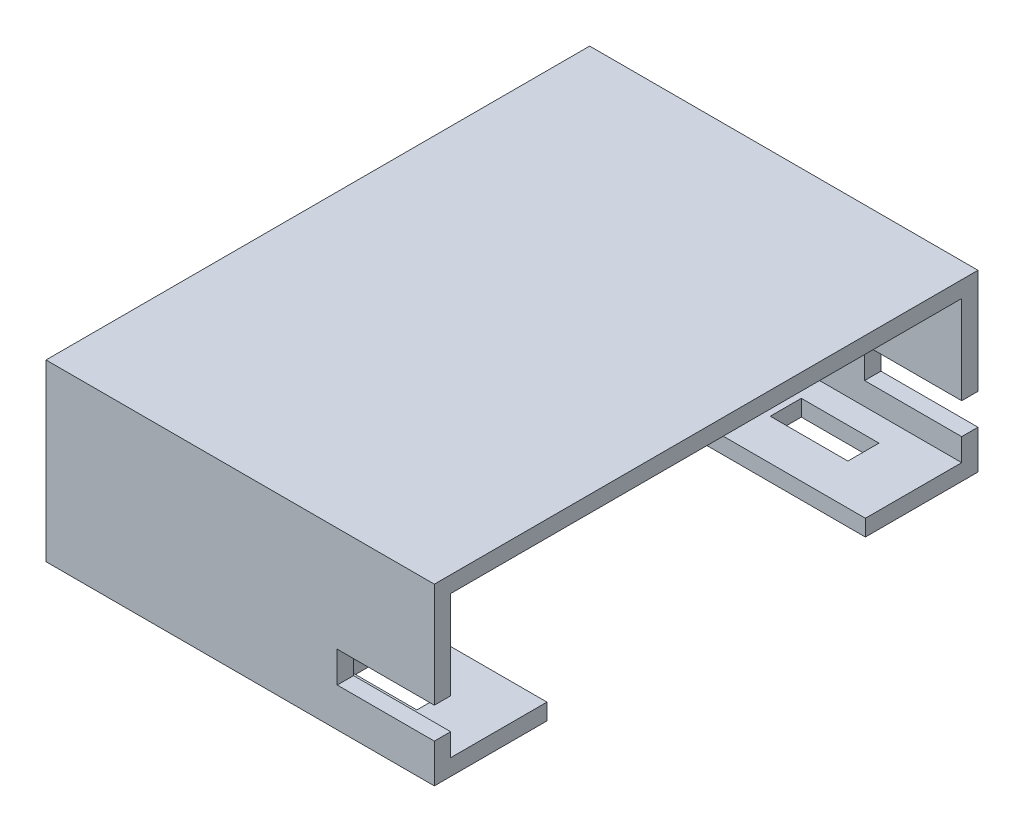
ISO-10303-21;
HEADER;
FILE_DESCRIPTION(('STEP AP214'),'2;1');
FILE_NAME('part.step','',(''),(''),'','','');
FILE_SCHEMA(('AUTOMOTIVE_DESIGN { 1 0 10303 214 1 1 1 1 }'));
ENDSEC;
DATA;
#1=APPLICATION_CONTEXT('core data for automotive mechanical design processes');
#2=APPLICATION_PROTOCOL_DEFINITION('international standard','automotive_design',2000,#1);
#3=PRODUCT_CONTEXT('',#1,'mechanical');
#4=PRODUCT('Part','Part','',(#3));
#5=PRODUCT_RELATED_PRODUCT_CATEGORY('part','',(#4));
#6=PRODUCT_DEFINITION_FORMATION('','',#4);
#7=PRODUCT_DEFINITION_CONTEXT('part definition',#1,'design');
#8=PRODUCT_DEFINITION('design','',#6,#7);
#9=PRODUCT_DEFINITION_SHAPE('','',#8);
#10=(LENGTH_UNIT() NAMED_UNIT(*) SI_UNIT(.MILLI.,.METRE.));
#11=(NAMED_UNIT(*) PLANE_ANGLE_UNIT() SI_UNIT($,.RADIAN.));
#12=(NAMED_UNIT(*) SI_UNIT($,.STERADIAN.) SOLID_ANGLE_UNIT());
#13=UNCERTAINTY_MEASURE_WITH_UNIT(LENGTH_MEASURE(1.E-05),#10,'distance_accuracy_value','');
#14=(GEOMETRIC_REPRESENTATION_CONTEXT(3) GLOBAL_UNCERTAINTY_ASSIGNED_CONTEXT((#13)) GLOBAL_UNIT_ASSIGNED_CONTEXT((#10,
#11,#12)) REPRESENTATION_CONTEXT('',''));
#15=CARTESIAN_POINT('',(0.,0.,0.));
#16=DIRECTION('',(0.,0.,1.));
#17=DIRECTION('',(1.,0.,0.));
#18=AXIS2_PLACEMENT_3D('',#15,#16,#17);
#19=CARTESIAN_POINT('',(10.,0.,-7.));
#20=DIRECTION('',(1.,0.,0.));
#21=DIRECTION('',(0.,0.,-1.));
#22=AXIS2_PLACEMENT_3D('',#19,#20,#21);
#23=PLANE('',#22);
#24=DIRECTION('',(0.,0.,1.));
#25=VECTOR('',#24,1.);
#26=CARTESIAN_POINT('',(10.,-3.5,-7.));
#27=LINE('',#26,#25);
#28=CARTESIAN_POINT('',(10.,-3.5,6.58));
#29=VERTEX_POINT('',#28);
#30=CARTESIAN_POINT('',(10.,-3.5,7.));
#31=VERTEX_POINT('',#30);
#32=EDGE_CURVE('E286',#29,#31,#27,.T.);
#33=ORIENTED_EDGE('',*,*,#32,.T.);
#34=DIRECTION('',(0.,-1.,0.));
#35=VECTOR('',#34,1.);
#36=CARTESIAN_POINT('',(10.,0.,7.));
#37=LINE('',#36,#35);
#38=CARTESIAN_POINT('',(10.,-4.5,7.));
#39=VERTEX_POINT('',#38);
#40=EDGE_CURVE('E418',#31,#39,#37,.T.);
#41=ORIENTED_EDGE('',*,*,#40,.T.);
#42=DIRECTION('',(0.,0.,1.));
#43=VECTOR('',#42,1.);
#44=CARTESIAN_POINT('',(10.,-4.5,-7.));
#45=LINE('',#44,#43);
#46=CARTESIAN_POINT('',(10.,-4.5,4.1));
#47=VERTEX_POINT('',#46);
#48=EDGE_CURVE('E411',#47,#39,#45,.T.);
#49=ORIENTED_EDGE('',*,*,#48,.F.);
#50=DIRECTION('',(0.,-1.,0.));
#51=VECTOR('',#50,1.);
#52=CARTESIAN_POINT('',(10.,-0.42,4.1));
#53=LINE('',#52,#51);
#54=CARTESIAN_POINT('',(10.,-4.08,4.1));
#55=VERTEX_POINT('',#54);
#56=EDGE_CURVE('E374',#55,#47,#53,.T.);
#57=ORIENTED_EDGE('',*,*,#56,.F.);
#58=DIRECTION('',(0.,0.,1.));
#59=VECTOR('',#58,1.);
#60=CARTESIAN_POINT('',(10.,-4.08,-7.001));
#61=LINE('',#60,#59);
#62=CARTESIAN_POINT('',(10.,-4.08,6.58));
#63=VERTEX_POINT('',#62);
#64=EDGE_CURVE('E364',#55,#63,#61,.T.);
#65=ORIENTED_EDGE('',*,*,#64,.T.);
#66=DIRECTION('',(0.,1.,0.));
#67=VECTOR('',#66,1.);
#68=CARTESIAN_POINT('',(10.,-4.08,6.58));
#69=LINE('',#68,#67);
#70=EDGE_CURVE('E355',#63,#29,#69,.T.);
#71=ORIENTED_EDGE('',*,*,#70,.T.);
#72=EDGE_LOOP('',(#33,#41,#49,#57,#65,#71));
#73=FACE_BOUND('',#72,.T.);
#74=ADVANCED_FACE('F33',(#73),#23,.T.);
#75=DIRECTION('',(0.,0.,-1.));
#76=VECTOR('',#75,1.);
#77=CARTESIAN_POINT('',(10.,-3.5,7.001));
#78=LINE('',#77,#76);
#79=CARTESIAN_POINT('',(10.,-3.5,-6.58));
#80=VERTEX_POINT('',#79);
#81=CARTESIAN_POINT('',(10.,-3.5,-7.));
#82=VERTEX_POINT('',#81);
#83=EDGE_CURVE('E324',#80,#82,#78,.T.);
#84=ORIENTED_EDGE('',*,*,#83,.F.);
#85=DIRECTION('',(0.,-1.,0.));
#86=VECTOR('',#85,1.);
#87=CARTESIAN_POINT('',(10.,-0.42,-6.58));
#88=LINE('',#87,#86);
#89=CARTESIAN_POINT('',(10.,-4.08,-6.58));
#90=VERTEX_POINT('',#89);
#91=EDGE_CURVE('E329',#80,#90,#88,.T.);
#92=ORIENTED_EDGE('',*,*,#91,.T.);
#93=DIRECTION('',(0.,0.,-1.));
#94=VECTOR('',#93,1.);
#95=CARTESIAN_POINT('',(10.,-4.08,7.001));
#96=LINE('',#95,#94);
#97=CARTESIAN_POINT('',(10.,-4.08,-4.1));
#98=VERTEX_POINT('',#97);
#99=EDGE_CURVE('E342',#98,#90,#96,.T.);
#100=ORIENTED_EDGE('',*,*,#99,.F.);
#101=DIRECTION('',(0.,1.,0.));
#102=VECTOR('',#101,1.);
#103=CARTESIAN_POINT('',(10.,-4.5,-4.1));
#104=LINE('',#103,#102);
#105=CARTESIAN_POINT('',(10.,-4.5,-4.1));
#106=VERTEX_POINT('',#105);
#107=EDGE_CURVE('E367',#106,#98,#104,.T.);
#108=ORIENTED_EDGE('',*,*,#107,.F.);
#109=CARTESIAN_POINT('',(10.,-4.5,-7.));
#110=VERTEX_POINT('',#109);
#111=EDGE_CURVE('E412',#110,#106,#45,.T.);
#112=ORIENTED_EDGE('',*,*,#111,.F.);
#113=DIRECTION('',(0.,-1.,0.));
#114=VECTOR('',#113,1.);
#115=CARTESIAN_POINT('',(10.,0.,-7.));
#116=LINE('',#115,#114);
#117=EDGE_CURVE('E421',#82,#110,#116,.T.);
#118=ORIENTED_EDGE('',*,*,#117,.F.);
#119=EDGE_LOOP('',(#84,#92,#100,#108,#112,#118));
#120=FACE_BOUND('',#119,.T.);
#121=ADVANCED_FACE('F465',(#120),#23,.T.);
#122=CARTESIAN_POINT('',(0.,0.,7.));
#123=DIRECTION('',(-1.,0.,0.));
#124=DIRECTION('',(0.,0.,1.));
#125=AXIS2_PLACEMENT_3D('',#122,#123,#124);
#126=PLANE('',#125);
#127=DIRECTION('',(0.,0.,-1.));
#128=VECTOR('',#127,1.);
#129=CARTESIAN_POINT('',(0.,-4.5,7.));
#130=LINE('',#129,#128);
#131=CARTESIAN_POINT('',(0.,-4.5,7.));
#132=VERTEX_POINT('',#131);
#133=CARTESIAN_POINT('',(0.,-4.5,-7.));
#134=VERTEX_POINT('',#133);
#135=EDGE_CURVE('E391',#132,#134,#130,.T.);
#136=ORIENTED_EDGE('',*,*,#135,.F.);
#137=DIRECTION('',(0.,-1.,0.));
#138=VECTOR('',#137,1.);
#139=CARTESIAN_POINT('',(0.,0.,7.));
#140=LINE('',#139,#138);
#141=CARTESIAN_POINT('',(0.,0.,7.));
#142=VERTEX_POINT('',#141);
#143=EDGE_CURVE('E11',#142,#132,#140,.T.);
#144=ORIENTED_EDGE('',*,*,#143,.F.);
#145=DIRECTION('',(0.,0.,-1.));
#146=VECTOR('',#145,1.);
#147=CARTESIAN_POINT('',(0.,0.,7.));
#148=LINE('',#147,#146);
#149=CARTESIAN_POINT('',(0.,0.,-7.));
#150=VERTEX_POINT('',#149);
#151=EDGE_CURVE('E393',#142,#150,#148,.T.);
#152=ORIENTED_EDGE('',*,*,#151,.T.);
#153=DIRECTION('',(0.,-1.,0.));
#154=VECTOR('',#153,1.);
#155=CARTESIAN_POINT('',(0.,0.,-7.));
#156=LINE('',#155,#154);
#157=EDGE_CURVE('E37',#150,#134,#156,.T.);
#158=ORIENTED_EDGE('',*,*,#157,.T.);
#159=EDGE_LOOP('',(#136,#144,#152,#158));
#160=FACE_BOUND('',#159,.T.);
#161=ADVANCED_FACE('F35',(#160),#126,.T.);
#162=CARTESIAN_POINT('',(10.,0.,7.));
#163=DIRECTION('',(0.,0.,1.));
#164=DIRECTION('',(1.,0.,0.));
#165=AXIS2_PLACEMENT_3D('',#162,#163,#164);
#166=PLANE('',#165);
#167=DIRECTION('',(1.,0.,0.));
#168=VECTOR('',#167,1.);
#169=CARTESIAN_POINT('',(7.5,-3.5,7.));
#170=LINE('',#169,#168);
#171=CARTESIAN_POINT('',(7.5,-3.5,7.));
#172=VERTEX_POINT('',#171);
#173=EDGE_CURVE('E278',#172,#31,#170,.T.);
#174=ORIENTED_EDGE('',*,*,#173,.F.);
#175=DIRECTION('',(0.,-1.,0.));
#176=VECTOR('',#175,1.);
#177=CARTESIAN_POINT('',(7.5,-2.7,7.));
#178=LINE('',#177,#176);
#179=CARTESIAN_POINT('',(7.5,-2.7,7.));
#180=VERTEX_POINT('',#179);
#181=EDGE_CURVE('E283',#180,#172,#178,.T.);
#182=ORIENTED_EDGE('',*,*,#181,.F.);
#183=DIRECTION('',(-1.,0.,0.));
#184=VECTOR('',#183,1.);
#185=CARTESIAN_POINT('',(10.,-2.7,7.));
#186=LINE('',#185,#184);
#187=CARTESIAN_POINT('',(10.,-2.7,7.));
#188=VERTEX_POINT('',#187);
#189=EDGE_CURVE('E280',#188,#180,#186,.T.);
#190=ORIENTED_EDGE('',*,*,#189,.F.);
#191=CARTESIAN_POINT('',(10.,0.,7.));
#192=VERTEX_POINT('',#191);
#193=EDGE_CURVE('E42',#192,#188,#37,.T.);
#194=ORIENTED_EDGE('',*,*,#193,.F.);
#195=DIRECTION('',(-1.,0.,0.));
#196=VECTOR('',#195,1.);
#197=CARTESIAN_POINT('',(10.,0.,7.));
#198=LINE('',#197,#196);
#199=EDGE_CURVE('E403',#192,#142,#198,.T.);
#200=ORIENTED_EDGE('',*,*,#199,.T.);
#201=ORIENTED_EDGE('',*,*,#143,.T.);
#202=DIRECTION('',(-1.,0.,0.));
#203=VECTOR('',#202,1.);
#204=CARTESIAN_POINT('',(10.,-4.5,7.));
#205=LINE('',#204,#203);
#206=EDGE_CURVE('E397',#39,#132,#205,.T.);
#207=ORIENTED_EDGE('',*,*,#206,.F.);
#208=ORIENTED_EDGE('',*,*,#40,.F.);
#209=EDGE_LOOP('',(#174,#182,#190,#194,#200,#201,#207,#208));
#210=FACE_BOUND('',#209,.T.);
#211=ADVANCED_FACE('F441',(#210),#166,.T.);
#212=DIRECTION('',(0.,0.,1.));
#213=VECTOR('',#212,1.);
#214=CARTESIAN_POINT('',(10.,-2.7,-7.));
#215=LINE('',#214,#213);
#216=CARTESIAN_POINT('',(10.,-2.7,6.58));
#217=VERTEX_POINT('',#216);
#218=EDGE_CURVE('E292',#217,#188,#215,.T.);
#219=ORIENTED_EDGE('',*,*,#218,.F.);
#220=CARTESIAN_POINT('',(10.,-0.42,6.58));
#221=VERTEX_POINT('',#220);
#222=EDGE_CURVE('E354',#217,#221,#69,.T.);
#223=ORIENTED_EDGE('',*,*,#222,.T.);
#224=DIRECTION('',(0.,0.,1.));
#225=VECTOR('',#224,1.);
#226=CARTESIAN_POINT('',(10.,-0.42,-4.1));
#227=LINE('',#226,#225);
#228=CARTESIAN_POINT('',(10.,-0.42,-6.58));
#229=VERTEX_POINT('',#228);
#230=EDGE_CURVE('E384',#229,#221,#227,.T.);
#231=ORIENTED_EDGE('',*,*,#230,.F.);
#232=CARTESIAN_POINT('',(10.,-2.7,-6.58));
#233=VERTEX_POINT('',#232);
#234=EDGE_CURVE('E330',#229,#233,#88,.T.);
#235=ORIENTED_EDGE('',*,*,#234,.T.);
#236=DIRECTION('',(0.,0.,-1.));
#237=VECTOR('',#236,1.);
#238=CARTESIAN_POINT('',(10.,-2.7,7.001));
#239=LINE('',#238,#237);
#240=CARTESIAN_POINT('',(10.,-2.7,-7.));
#241=VERTEX_POINT('',#240);
#242=EDGE_CURVE('E321',#233,#241,#239,.T.);
#243=ORIENTED_EDGE('',*,*,#242,.T.);
#244=CARTESIAN_POINT('',(10.,0.,-7.));
#245=VERTEX_POINT('',#244);
#246=EDGE_CURVE('E419',#245,#241,#116,.T.);
#247=ORIENTED_EDGE('',*,*,#246,.F.);
#248=DIRECTION('',(0.,0.,1.));
#249=VECTOR('',#248,1.);
#250=CARTESIAN_POINT('',(10.,0.,-7.));
#251=LINE('',#250,#249);
#252=EDGE_CURVE('E400',#245,#192,#251,.T.);
#253=ORIENTED_EDGE('',*,*,#252,.T.);
#254=ORIENTED_EDGE('',*,*,#193,.T.);
#255=EDGE_LOOP('',(#219,#223,#231,#235,#243,#247,#253,#254));
#256=FACE_BOUND('',#255,.T.);
#257=ADVANCED_FACE('F448',(#256),#23,.T.);
#258=CARTESIAN_POINT('',(0.,0.,-7.));
#259=DIRECTION('',(0.,0.,-1.));
#260=DIRECTION('',(-1.,0.,0.));
#261=AXIS2_PLACEMENT_3D('',#258,#259,#260);
#262=PLANE('',#261);
#263=DIRECTION('',(-1.,0.,0.));
#264=VECTOR('',#263,1.);
#265=CARTESIAN_POINT('',(10.,-3.5,-7.));
#266=LINE('',#265,#264);
#267=CARTESIAN_POINT('',(7.5,-3.5,-7.));
#268=VERTEX_POINT('',#267);
#269=EDGE_CURVE('E307',#82,#268,#266,.T.);
#270=ORIENTED_EDGE('',*,*,#269,.F.);
#271=ORIENTED_EDGE('',*,*,#117,.T.);
#272=DIRECTION('',(1.,0.,0.));
#273=VECTOR('',#272,1.);
#274=CARTESIAN_POINT('',(0.,-4.5,-7.));
#275=LINE('',#274,#273);
#276=EDGE_CURVE('E408',#134,#110,#275,.T.);
#277=ORIENTED_EDGE('',*,*,#276,.F.);
#278=ORIENTED_EDGE('',*,*,#157,.F.);
#279=DIRECTION('',(1.,0.,0.));
#280=VECTOR('',#279,1.);
#281=CARTESIAN_POINT('',(0.,0.,-7.));
#282=LINE('',#281,#280);
#283=EDGE_CURVE('E396',#150,#245,#282,.T.);
#284=ORIENTED_EDGE('',*,*,#283,.T.);
#285=ORIENTED_EDGE('',*,*,#246,.T.);
#286=DIRECTION('',(1.,0.,0.));
#287=VECTOR('',#286,1.);
#288=CARTESIAN_POINT('',(7.5,-2.7,-7.));
#289=LINE('',#288,#287);
#290=CARTESIAN_POINT('',(7.5,-2.7,-7.));
#291=VERTEX_POINT('',#290);
#292=EDGE_CURVE('E309',#291,#241,#289,.T.);
#293=ORIENTED_EDGE('',*,*,#292,.F.);
#294=DIRECTION('',(0.,1.,0.));
#295=VECTOR('',#294,1.);
#296=CARTESIAN_POINT('',(7.5,-3.5,-7.));
#297=LINE('',#296,#295);
#298=EDGE_CURVE('E312',#268,#291,#297,.T.);
#299=ORIENTED_EDGE('',*,*,#298,.F.);
#300=EDGE_LOOP('',(#270,#271,#277,#278,#284,#285,#293,#299));
#301=FACE_BOUND('',#300,.T.);
#302=ADVANCED_FACE('F432',(#301),#262,.T.);
#303=CARTESIAN_POINT('',(0.,0.,0.));
#304=DIRECTION('',(0.,-1.,0.));
#305=DIRECTION('',(0.,0.,-1.));
#306=AXIS2_PLACEMENT_3D('',#303,#304,#305);
#307=PLANE('',#306);
#308=ORIENTED_EDGE('',*,*,#151,.F.);
#309=ORIENTED_EDGE('',*,*,#199,.F.);
#310=ORIENTED_EDGE('',*,*,#252,.F.);
#311=ORIENTED_EDGE('',*,*,#283,.F.);
#312=EDGE_LOOP('',(#308,#309,#310,#311));
#313=FACE_BOUND('',#312,.T.);
#314=ADVANCED_FACE('F444',(#313),#307,.F.);
#315=CARTESIAN_POINT('',(0.,-4.5,0.));
#316=DIRECTION('',(0.,-1.,0.));
#317=DIRECTION('',(0.,0.,-1.));
#318=AXIS2_PLACEMENT_3D('',#315,#316,#317);
#319=PLANE('',#318);
#320=DIRECTION('',(-1.,0.,0.));
#321=VECTOR('',#320,1.);
#322=CARTESIAN_POINT('',(8.5,-4.5,-5.149999999999));
#323=LINE('',#322,#321);
#324=CARTESIAN_POINT('',(8.5,-4.5,-5.149999999999));
#325=VERTEX_POINT('',#324);
#326=CARTESIAN_POINT('',(6.5,-4.5,-5.149999999999));
#327=VERTEX_POINT('',#326);
#328=EDGE_CURVE('E689',#325,#327,#323,.T.);
#329=ORIENTED_EDGE('',*,*,#328,.F.);
#330=DIRECTION('',(0.,0.,1.));
#331=VECTOR('',#330,1.);
#332=CARTESIAN_POINT('',(8.5,-4.5,-5.950000000003));
#333=LINE('',#332,#331);
#334=CARTESIAN_POINT('',(8.5,-4.5,-5.950000000003));
#335=VERTEX_POINT('',#334);
#336=EDGE_CURVE('E239',#335,#325,#333,.T.);
#337=ORIENTED_EDGE('',*,*,#336,.F.);
#338=DIRECTION('',(1.,0.,0.));
#339=VECTOR('',#338,1.);
#340=CARTESIAN_POINT('',(6.5,-4.5,-5.950000000003));
#341=LINE('',#340,#339);
#342=CARTESIAN_POINT('',(6.5,-4.5,-5.950000000003));
#343=VERTEX_POINT('',#342);
#344=EDGE_CURVE('E50',#343,#335,#341,.T.);
#345=ORIENTED_EDGE('',*,*,#344,.F.);
#346=DIRECTION('',(0.,0.,-1.));
#347=VECTOR('',#346,1.);
#348=CARTESIAN_POINT('',(6.5,-4.5,-5.149999999999));
#349=LINE('',#348,#347);
#350=EDGE_CURVE('E687',#327,#343,#349,.T.);
#351=ORIENTED_EDGE('',*,*,#350,.F.);
#352=EDGE_LOOP('',(#329,#337,#345,#351));
#353=FACE_BOUND('',#352,.T.);
#354=DIRECTION('',(-1.,0.,0.));
#355=VECTOR('',#354,1.);
#356=CARTESIAN_POINT('',(8.5,-4.5,5.949999999999));
#357=LINE('',#356,#355);
#358=CARTESIAN_POINT('',(8.5,-4.5,5.949999999999));
#359=VERTEX_POINT('',#358);
#360=CARTESIAN_POINT('',(6.5,-4.5,5.949999999999));
#361=VERTEX_POINT('',#360);
#362=EDGE_CURVE('E256',#359,#361,#357,.T.);
#363=ORIENTED_EDGE('',*,*,#362,.F.);
#364=DIRECTION('',(0.,0.,1.));
#365=VECTOR('',#364,1.);
#366=CARTESIAN_POINT('',(8.5,-4.5,5.149999999999));
#367=LINE('',#366,#365);
#368=CARTESIAN_POINT('',(8.5,-4.5,5.149999999999));
#369=VERTEX_POINT('',#368);
#370=EDGE_CURVE('E259',#369,#359,#367,.T.);
#371=ORIENTED_EDGE('',*,*,#370,.F.);
#372=DIRECTION('',(1.,0.,0.));
#373=VECTOR('',#372,1.);
#374=CARTESIAN_POINT('',(6.5,-4.5,5.149999999999));
#375=LINE('',#374,#373);
#376=CARTESIAN_POINT('',(6.5,-4.5,5.149999999999));
#377=VERTEX_POINT('',#376);
#378=EDGE_CURVE('E250',#377,#369,#375,.T.);
#379=ORIENTED_EDGE('',*,*,#378,.F.);
#380=DIRECTION('',(0.,0.,-1.));
#381=VECTOR('',#380,1.);
#382=CARTESIAN_POINT('',(6.5,-4.5,5.949999999999));
#383=LINE('',#382,#381);
#384=EDGE_CURVE('E253',#361,#377,#383,.T.);
#385=ORIENTED_EDGE('',*,*,#384,.F.);
#386=EDGE_LOOP('',(#363,#371,#379,#385));
#387=FACE_BOUND('',#386,.T.);
#388=DIRECTION('',(1.,0.,0.));
#389=VECTOR('',#388,1.);
#390=CARTESIAN_POINT('',(5.,-4.5,4.1));
#391=LINE('',#390,#389);
#392=CARTESIAN_POINT('',(5.,-4.5,4.1));
#393=VERTEX_POINT('',#392);
#394=EDGE_CURVE('E388',#393,#47,#391,.T.);
#395=ORIENTED_EDGE('',*,*,#394,.T.);
#396=ORIENTED_EDGE('',*,*,#48,.T.);
#397=ORIENTED_EDGE('',*,*,#206,.T.);
#398=ORIENTED_EDGE('',*,*,#135,.T.);
#399=ORIENTED_EDGE('',*,*,#276,.T.);
#400=ORIENTED_EDGE('',*,*,#111,.T.);
#401=DIRECTION('',(1.,0.,0.));
#402=VECTOR('',#401,1.);
#403=CARTESIAN_POINT('',(5.,-4.5,-4.1));
#404=LINE('',#403,#402);
#405=CARTESIAN_POINT('',(5.,-4.5,-4.1));
#406=VERTEX_POINT('',#405);
#407=EDGE_CURVE('E381',#406,#106,#404,.T.);
#408=ORIENTED_EDGE('',*,*,#407,.F.);
#409=DIRECTION('',(0.,0.,-1.));
#410=VECTOR('',#409,1.);
#411=CARTESIAN_POINT('',(5.,-4.5,4.1));
#412=LINE('',#411,#410);
#413=EDGE_CURVE('E370',#393,#406,#412,.T.);
#414=ORIENTED_EDGE('',*,*,#413,.F.);
#415=EDGE_LOOP('',(#395,#396,#397,#398,#399,#400,#408,#414));
#416=FACE_BOUND('',#415,.T.);
#417=ADVANCED_FACE('F434',(#353,#387,#416),#319,.T.);
#418=CARTESIAN_POINT('',(5.,-0.42,4.1));
#419=DIRECTION('',(0.,0.,1.));
#420=DIRECTION('',(0.,-1.,0.));
#421=AXIS2_PLACEMENT_3D('',#418,#419,#420);
#422=PLANE('',#421);
#423=DIRECTION('',(0.,-1.,0.));
#424=VECTOR('',#423,1.);
#425=CARTESIAN_POINT('',(5.,-0.42,4.1));
#426=LINE('',#425,#424);
#427=CARTESIAN_POINT('',(5.,-4.08,4.1));
#428=VERTEX_POINT('',#427);
#429=EDGE_CURVE('E379',#428,#393,#426,.T.);
#430=ORIENTED_EDGE('',*,*,#429,.F.);
#431=DIRECTION('',(-1.,0.,0.));
#432=VECTOR('',#431,1.);
#433=CARTESIAN_POINT('',(5.,-4.08,4.1));
#434=LINE('',#433,#432);
#435=EDGE_CURVE('E349',#55,#428,#434,.T.);
#436=ORIENTED_EDGE('',*,*,#435,.F.);
#437=ORIENTED_EDGE('',*,*,#56,.T.);
#438=ORIENTED_EDGE('',*,*,#394,.F.);
#439=EDGE_LOOP('',(#430,#436,#437,#438));
#440=FACE_BOUND('',#439,.T.);
#441=ADVANCED_FACE('F480',(#440),#422,.F.);
#442=CARTESIAN_POINT('',(5.,-0.42,-4.1));
#443=DIRECTION('',(0.,1.,0.));
#444=DIRECTION('',(0.,0.,1.));
#445=AXIS2_PLACEMENT_3D('',#442,#443,#444);
#446=PLANE('',#445);
#447=ORIENTED_EDGE('',*,*,#230,.T.);
#448=DIRECTION('',(-1.,0.,0.));
#449=VECTOR('',#448,1.);
#450=CARTESIAN_POINT('',(10.,-0.42,6.58));
#451=LINE('',#450,#449);
#452=CARTESIAN_POINT('',(5.,-0.42,6.58));
#453=VERTEX_POINT('',#452);
#454=EDGE_CURVE('E358',#221,#453,#451,.T.);
#455=ORIENTED_EDGE('',*,*,#454,.T.);
#456=DIRECTION('',(0.,0.,1.));
#457=VECTOR('',#456,1.);
#458=CARTESIAN_POINT('',(5.,-0.42,-4.1));
#459=LINE('',#458,#457);
#460=CARTESIAN_POINT('',(5.,-0.42,-6.58));
#461=VERTEX_POINT('',#460);
#462=EDGE_CURVE('E377',#461,#453,#459,.T.);
#463=ORIENTED_EDGE('',*,*,#462,.F.);
#464=DIRECTION('',(1.,0.,0.));
#465=VECTOR('',#464,1.);
#466=CARTESIAN_POINT('',(5.,-0.42,-6.58));
#467=LINE('',#466,#465);
#468=EDGE_CURVE('E339',#461,#229,#467,.T.);
#469=ORIENTED_EDGE('',*,*,#468,.T.);
#470=EDGE_LOOP('',(#447,#455,#463,#469));
#471=FACE_BOUND('',#470,.T.);
#472=ADVANCED_FACE('F500',(#471),#446,.F.);
#473=CARTESIAN_POINT('',(5.,-4.5,-4.1));
#474=DIRECTION('',(0.,0.,-1.));
#475=DIRECTION('',(0.,1.,0.));
#476=AXIS2_PLACEMENT_3D('',#473,#474,#475);
#477=PLANE('',#476);
#478=ORIENTED_EDGE('',*,*,#107,.T.);
#479=DIRECTION('',(1.,0.,0.));
#480=VECTOR('',#479,1.);
#481=CARTESIAN_POINT('',(10.,-4.08,-4.1));
#482=LINE('',#481,#480);
#483=CARTESIAN_POINT('',(5.,-4.08,-4.1));
#484=VERTEX_POINT('',#483);
#485=EDGE_CURVE('E345',#484,#98,#482,.T.);
#486=ORIENTED_EDGE('',*,*,#485,.F.);
#487=DIRECTION('',(0.,1.,0.));
#488=VECTOR('',#487,1.);
#489=CARTESIAN_POINT('',(5.,-4.5,-4.1));
#490=LINE('',#489,#488);
#491=EDGE_CURVE('E373',#406,#484,#490,.T.);
#492=ORIENTED_EDGE('',*,*,#491,.F.);
#493=ORIENTED_EDGE('',*,*,#407,.T.);
#494=EDGE_LOOP('',(#478,#486,#492,#493));
#495=FACE_BOUND('',#494,.T.);
#496=ADVANCED_FACE('F471',(#495),#477,.F.);
#497=CARTESIAN_POINT('',(5.,0.,0.));
#498=DIRECTION('',(1.,0.,0.));
#499=DIRECTION('',(0.,0.,-1.));
#500=AXIS2_PLACEMENT_3D('',#497,#498,#499);
#501=PLANE('',#500);
#502=ORIENTED_EDGE('',*,*,#413,.T.);
#503=ORIENTED_EDGE('',*,*,#491,.T.);
#504=DIRECTION('',(0.,0.,-1.));
#505=VECTOR('',#504,1.);
#506=CARTESIAN_POINT('',(5.,-4.08,7.001));
#507=LINE('',#506,#505);
#508=CARTESIAN_POINT('',(5.,-4.08,-6.58));
#509=VERTEX_POINT('',#508);
#510=EDGE_CURVE('E343',#484,#509,#507,.T.);
#511=ORIENTED_EDGE('',*,*,#510,.T.);
#512=DIRECTION('',(0.,1.,0.));
#513=VECTOR('',#512,1.);
#514=CARTESIAN_POINT('',(5.,-4.08,-6.58));
#515=LINE('',#514,#513);
#516=EDGE_CURVE('E336',#509,#461,#515,.T.);
#517=ORIENTED_EDGE('',*,*,#516,.T.);
#518=ORIENTED_EDGE('',*,*,#462,.T.);
#519=DIRECTION('',(0.,-1.,0.));
#520=VECTOR('',#519,1.);
#521=CARTESIAN_POINT('',(5.,-0.42,6.58));
#522=LINE('',#521,#520);
#523=CARTESIAN_POINT('',(5.,-4.08,6.58));
#524=VERTEX_POINT('',#523);
#525=EDGE_CURVE('E361',#453,#524,#522,.T.);
#526=ORIENTED_EDGE('',*,*,#525,.T.);
#527=DIRECTION('',(0.,0.,1.));
#528=VECTOR('',#527,1.);
#529=CARTESIAN_POINT('',(5.,-4.08,-7.001));
#530=LINE('',#529,#528);
#531=EDGE_CURVE('E365',#428,#524,#530,.T.);
#532=ORIENTED_EDGE('',*,*,#531,.F.);
#533=ORIENTED_EDGE('',*,*,#429,.T.);
#534=EDGE_LOOP('',(#502,#503,#511,#517,#518,#526,#532,#533));
#535=FACE_BOUND('',#534,.T.);
#536=ADVANCED_FACE('F474',(#535),#501,.T.);
#537=CARTESIAN_POINT('',(5.,-4.08,-7.001));
#538=DIRECTION('',(0.,-1.,0.));
#539=DIRECTION('',(0.,0.,-1.));
#540=AXIS2_PLACEMENT_3D('',#537,#538,#539);
#541=PLANE('',#540);
#542=DIRECTION('',(0.,0.,-1.));
#543=VECTOR('',#542,1.);
#544=CARTESIAN_POINT('',(8.5,-4.08,5.149999999999));
#545=LINE('',#544,#543);
#546=CARTESIAN_POINT('',(8.5,-4.08,5.949999999999));
#547=VERTEX_POINT('',#546);
#548=CARTESIAN_POINT('',(8.5,-4.08,5.149999999999));
#549=VERTEX_POINT('',#548);
#550=EDGE_CURVE('E249',#547,#549,#545,.T.);
#551=ORIENTED_EDGE('',*,*,#550,.F.);
#552=DIRECTION('',(1.,0.,0.));
#553=VECTOR('',#552,1.);
#554=CARTESIAN_POINT('',(8.5,-4.08,5.949999999999));
#555=LINE('',#554,#553);
#556=CARTESIAN_POINT('',(6.5,-4.08,5.949999999999));
#557=VERTEX_POINT('',#556);
#558=EDGE_CURVE('E247',#557,#547,#555,.T.);
#559=ORIENTED_EDGE('',*,*,#558,.F.);
#560=DIRECTION('',(0.,0.,1.));
#561=VECTOR('',#560,1.);
#562=CARTESIAN_POINT('',(6.5,-4.08,5.949999999999));
#563=LINE('',#562,#561);
#564=CARTESIAN_POINT('',(6.5,-4.08,5.149999999999));
#565=VERTEX_POINT('',#564);
#566=EDGE_CURVE('E262',#565,#557,#563,.T.);
#567=ORIENTED_EDGE('',*,*,#566,.F.);
#568=DIRECTION('',(-1.,0.,0.));
#569=VECTOR('',#568,1.);
#570=CARTESIAN_POINT('',(6.5,-4.08,5.149999999999));
#571=LINE('',#570,#569);
#572=EDGE_CURVE('E265',#549,#565,#571,.T.);
#573=ORIENTED_EDGE('',*,*,#572,.F.);
#574=EDGE_LOOP('',(#551,#559,#567,#573));
#575=FACE_BOUND('',#574,.T.);
#576=ORIENTED_EDGE('',*,*,#435,.T.);
#577=ORIENTED_EDGE('',*,*,#531,.T.);
#578=DIRECTION('',(1.,0.,0.));
#579=VECTOR('',#578,1.);
#580=CARTESIAN_POINT('',(5.,-4.08,6.58));
#581=LINE('',#580,#579);
#582=EDGE_CURVE('E351',#524,#63,#581,.T.);
#583=ORIENTED_EDGE('',*,*,#582,.T.);
#584=ORIENTED_EDGE('',*,*,#64,.F.);
#585=EDGE_LOOP('',(#576,#577,#583,#584));
#586=FACE_BOUND('',#585,.T.);
#587=ADVANCED_FACE('F511',(#575,#586),#541,.F.);
#588=CARTESIAN_POINT('',(0.,0.,6.58));
#589=DIRECTION('',(0.,0.,1.));
#590=DIRECTION('',(1.,0.,0.));
#591=AXIS2_PLACEMENT_3D('',#588,#589,#590);
#592=PLANE('',#591);
#593=DIRECTION('',(0.,-1.,0.));
#594=VECTOR('',#593,1.);
#595=CARTESIAN_POINT('',(7.5,0.,6.58));
#596=LINE('',#595,#594);
#597=CARTESIAN_POINT('',(7.5,-2.7,6.58));
#598=VERTEX_POINT('',#597);
#599=CARTESIAN_POINT('',(7.5,-3.5,6.58));
#600=VERTEX_POINT('',#599);
#601=EDGE_CURVE('E289',#598,#600,#596,.T.);
#602=ORIENTED_EDGE('',*,*,#601,.T.);
#603=DIRECTION('',(1.,0.,0.));
#604=VECTOR('',#603,1.);
#605=CARTESIAN_POINT('',(0.,-3.5,6.58));
#606=LINE('',#605,#604);
#607=EDGE_CURVE('E301',#600,#29,#606,.T.);
#608=ORIENTED_EDGE('',*,*,#607,.T.);
#609=ORIENTED_EDGE('',*,*,#70,.F.);
#610=ORIENTED_EDGE('',*,*,#582,.F.);
#611=ORIENTED_EDGE('',*,*,#525,.F.);
#612=ORIENTED_EDGE('',*,*,#454,.F.);
#613=ORIENTED_EDGE('',*,*,#222,.F.);
#614=DIRECTION('',(-1.,0.,0.));
#615=VECTOR('',#614,1.);
#616=CARTESIAN_POINT('',(0.,-2.7,6.58));
#617=LINE('',#616,#615);
#618=EDGE_CURVE('E298',#217,#598,#617,.T.);
#619=ORIENTED_EDGE('',*,*,#618,.T.);
#620=EDGE_LOOP('',(#602,#608,#609,#610,#611,#612,#613,#619));
#621=FACE_BOUND('',#620,.T.);
#622=ADVANCED_FACE('F487',(#621),#592,.F.);
#623=CARTESIAN_POINT('',(10.,-4.08,7.001));
#624=DIRECTION('',(0.,-1.,0.));
#625=DIRECTION('',(0.,0.,-1.));
#626=AXIS2_PLACEMENT_3D('',#623,#624,#625);
#627=PLANE('',#626);
#628=DIRECTION('',(0.,0.,-1.));
#629=VECTOR('',#628,1.);
#630=CARTESIAN_POINT('',(8.5,-4.08,-5.950000000003));
#631=LINE('',#630,#629);
#632=CARTESIAN_POINT('',(8.5,-4.08,-5.149999999999));
#633=VERTEX_POINT('',#632);
#634=CARTESIAN_POINT('',(8.5,-4.08,-5.950000000003));
#635=VERTEX_POINT('',#634);
#636=EDGE_CURVE('E230',#633,#635,#631,.T.);
#637=ORIENTED_EDGE('',*,*,#636,.F.);
#638=DIRECTION('',(1.,0.,0.));
#639=VECTOR('',#638,1.);
#640=CARTESIAN_POINT('',(8.5,-4.08,-5.149999999999));
#641=LINE('',#640,#639);
#642=CARTESIAN_POINT('',(6.5,-4.08,-5.149999999999));
#643=VERTEX_POINT('',#642);
#644=EDGE_CURVE('E58',#643,#633,#641,.T.);
#645=ORIENTED_EDGE('',*,*,#644,.F.);
#646=DIRECTION('',(0.,0.,1.));
#647=VECTOR('',#646,1.);
#648=CARTESIAN_POINT('',(6.5,-4.08,-5.149999999999));
#649=LINE('',#648,#647);
#650=CARTESIAN_POINT('',(6.5,-4.08,-5.950000000003));
#651=VERTEX_POINT('',#650);
#652=EDGE_CURVE('E237',#651,#643,#649,.T.);
#653=ORIENTED_EDGE('',*,*,#652,.F.);
#654=DIRECTION('',(-1.,0.,0.));
#655=VECTOR('',#654,1.);
#656=CARTESIAN_POINT('',(6.5,-4.08,-5.950000000003));
#657=LINE('',#656,#655);
#658=EDGE_CURVE('E221',#635,#651,#657,.T.);
#659=ORIENTED_EDGE('',*,*,#658,.F.);
#660=EDGE_LOOP('',(#637,#645,#653,#659));
#661=FACE_BOUND('',#660,.T.);
#662=ORIENTED_EDGE('',*,*,#485,.T.);
#663=ORIENTED_EDGE('',*,*,#99,.T.);
#664=DIRECTION('',(-1.,0.,0.));
#665=VECTOR('',#664,1.);
#666=CARTESIAN_POINT('',(10.,-4.08,-6.58));
#667=LINE('',#666,#665);
#668=EDGE_CURVE('E333',#90,#509,#667,.T.);
#669=ORIENTED_EDGE('',*,*,#668,.T.);
#670=ORIENTED_EDGE('',*,*,#510,.F.);
#671=EDGE_LOOP('',(#662,#663,#669,#670));
#672=FACE_BOUND('',#671,.T.);
#673=ADVANCED_FACE('F234',(#661,#672),#627,.F.);
#674=CARTESIAN_POINT('',(0.,0.,-6.58));
#675=DIRECTION('',(0.,0.,-1.));
#676=DIRECTION('',(-1.,0.,0.));
#677=AXIS2_PLACEMENT_3D('',#674,#675,#676);
#678=PLANE('',#677);
#679=ORIENTED_EDGE('',*,*,#91,.F.);
#680=DIRECTION('',(1.,0.,0.));
#681=VECTOR('',#680,1.);
#682=CARTESIAN_POINT('',(9.99999999999999,-3.5,-6.58));
#683=LINE('',#682,#681);
#684=CARTESIAN_POINT('',(7.5,-3.5,-6.58));
#685=VERTEX_POINT('',#684);
#686=EDGE_CURVE('E305',#685,#80,#683,.T.);
#687=ORIENTED_EDGE('',*,*,#686,.F.);
#688=DIRECTION('',(0.,-1.,0.));
#689=VECTOR('',#688,1.);
#690=CARTESIAN_POINT('',(7.5,-3.5,-6.58));
#691=LINE('',#690,#689);
#692=CARTESIAN_POINT('',(7.5,-2.7,-6.58));
#693=VERTEX_POINT('',#692);
#694=EDGE_CURVE('E308',#693,#685,#691,.T.);
#695=ORIENTED_EDGE('',*,*,#694,.F.);
#696=DIRECTION('',(-1.,0.,0.));
#697=VECTOR('',#696,1.);
#698=CARTESIAN_POINT('',(7.5,-2.7,-6.58));
#699=LINE('',#698,#697);
#700=EDGE_CURVE('E304',#233,#693,#699,.T.);
#701=ORIENTED_EDGE('',*,*,#700,.F.);
#702=ORIENTED_EDGE('',*,*,#234,.F.);
#703=ORIENTED_EDGE('',*,*,#468,.F.);
#704=ORIENTED_EDGE('',*,*,#516,.F.);
#705=ORIENTED_EDGE('',*,*,#668,.F.);
#706=EDGE_LOOP('',(#679,#687,#695,#701,#702,#703,#704,#705));
#707=FACE_BOUND('',#706,.T.);
#708=ADVANCED_FACE('F456',(#707),#678,.F.);
#709=CARTESIAN_POINT('',(10.,-3.5,7.001));
#710=DIRECTION('',(0.,-1.,0.));
#711=DIRECTION('',(0.,0.,-1.));
#712=AXIS2_PLACEMENT_3D('',#709,#710,#711);
#713=PLANE('',#712);
#714=ORIENTED_EDGE('',*,*,#686,.T.);
#715=ORIENTED_EDGE('',*,*,#83,.T.);
#716=ORIENTED_EDGE('',*,*,#269,.T.);
#717=DIRECTION('',(0.,0.,-1.));
#718=VECTOR('',#717,1.);
#719=CARTESIAN_POINT('',(7.5,-3.5,7.001));
#720=LINE('',#719,#718);
#721=EDGE_CURVE('E311',#685,#268,#720,.T.);
#722=ORIENTED_EDGE('',*,*,#721,.F.);
#723=EDGE_LOOP('',(#714,#715,#716,#722));
#724=FACE_BOUND('',#723,.T.);
#725=ADVANCED_FACE('F509',(#724),#713,.F.);
#726=CARTESIAN_POINT('',(7.5,-3.5,7.001));
#727=DIRECTION('',(-1.,0.,0.));
#728=DIRECTION('',(0.,0.,1.));
#729=AXIS2_PLACEMENT_3D('',#726,#727,#728);
#730=PLANE('',#729);
#731=ORIENTED_EDGE('',*,*,#694,.T.);
#732=ORIENTED_EDGE('',*,*,#721,.T.);
#733=ORIENTED_EDGE('',*,*,#298,.T.);
#734=DIRECTION('',(0.,0.,-1.));
#735=VECTOR('',#734,1.);
#736=CARTESIAN_POINT('',(7.5,-2.7,7.001));
#737=LINE('',#736,#735);
#738=EDGE_CURVE('E325',#693,#291,#737,.T.);
#739=ORIENTED_EDGE('',*,*,#738,.F.);
#740=EDGE_LOOP('',(#731,#732,#733,#739));
#741=FACE_BOUND('',#740,.T.);
#742=ADVANCED_FACE('F460',(#741),#730,.F.);
#743=CARTESIAN_POINT('',(7.5,-2.7,7.001));
#744=DIRECTION('',(0.,1.,0.));
#745=DIRECTION('',(0.,0.,1.));
#746=AXIS2_PLACEMENT_3D('',#743,#744,#745);
#747=PLANE('',#746);
#748=ORIENTED_EDGE('',*,*,#700,.T.);
#749=ORIENTED_EDGE('',*,*,#738,.T.);
#750=ORIENTED_EDGE('',*,*,#292,.T.);
#751=ORIENTED_EDGE('',*,*,#242,.F.);
#752=EDGE_LOOP('',(#748,#749,#750,#751));
#753=FACE_BOUND('',#752,.T.);
#754=ADVANCED_FACE('F452',(#753),#747,.F.);
#755=CARTESIAN_POINT('',(7.5,-3.5,-7.));
#756=DIRECTION('',(0.,-1.,0.));
#757=DIRECTION('',(0.,0.,-1.));
#758=AXIS2_PLACEMENT_3D('',#755,#756,#757);
#759=PLANE('',#758);
#760=DIRECTION('',(0.,0.,1.));
#761=VECTOR('',#760,1.);
#762=CARTESIAN_POINT('',(7.5,-3.5,-7.));
#763=LINE('',#762,#761);
#764=EDGE_CURVE('E287',#600,#172,#763,.T.);
#765=ORIENTED_EDGE('',*,*,#764,.T.);
#766=ORIENTED_EDGE('',*,*,#173,.T.);
#767=ORIENTED_EDGE('',*,*,#32,.F.);
#768=ORIENTED_EDGE('',*,*,#607,.F.);
#769=EDGE_LOOP('',(#765,#766,#767,#768));
#770=FACE_BOUND('',#769,.T.);
#771=ADVANCED_FACE('F484',(#770),#759,.F.);
#772=CARTESIAN_POINT('',(10.,-2.7,-7.));
#773=DIRECTION('',(0.,1.,0.));
#774=DIRECTION('',(0.,0.,1.));
#775=AXIS2_PLACEMENT_3D('',#772,#773,#774);
#776=PLANE('',#775);
#777=ORIENTED_EDGE('',*,*,#218,.T.);
#778=ORIENTED_EDGE('',*,*,#189,.T.);
#779=DIRECTION('',(0.,0.,1.));
#780=VECTOR('',#779,1.);
#781=CARTESIAN_POINT('',(7.5,-2.7,-7.));
#782=LINE('',#781,#780);
#783=EDGE_CURVE('E290',#598,#180,#782,.T.);
#784=ORIENTED_EDGE('',*,*,#783,.F.);
#785=ORIENTED_EDGE('',*,*,#618,.F.);
#786=EDGE_LOOP('',(#777,#778,#784,#785));
#787=FACE_BOUND('',#786,.T.);
#788=ADVANCED_FACE('F496',(#787),#776,.F.);
#789=CARTESIAN_POINT('',(7.5,-2.7,-7.));
#790=DIRECTION('',(-1.,0.,0.));
#791=DIRECTION('',(0.,0.,1.));
#792=AXIS2_PLACEMENT_3D('',#789,#790,#791);
#793=PLANE('',#792);
#794=ORIENTED_EDGE('',*,*,#783,.T.);
#795=ORIENTED_EDGE('',*,*,#181,.T.);
#796=ORIENTED_EDGE('',*,*,#764,.F.);
#797=ORIENTED_EDGE('',*,*,#601,.F.);
#798=EDGE_LOOP('',(#794,#795,#796,#797));
#799=FACE_BOUND('',#798,.T.);
#800=ADVANCED_FACE('F492',(#799),#793,.F.);
#801=CARTESIAN_POINT('',(8.5,0.00100000000000013,5.949999999999));
#802=DIRECTION('',(0.,0.,1.));
#803=DIRECTION('',(1.,0.,0.));
#804=AXIS2_PLACEMENT_3D('',#801,#802,#803);
#805=PLANE('',#804);
#806=ORIENTED_EDGE('',*,*,#558,.T.);
#807=DIRECTION('',(0.,-1.,0.));
#808=VECTOR('',#807,1.);
#809=CARTESIAN_POINT('',(8.5,0.00100000000000013,5.949999999999));
#810=LINE('',#809,#808);
#811=EDGE_CURVE('E273',#547,#359,#810,.T.);
#812=ORIENTED_EDGE('',*,*,#811,.T.);
#813=ORIENTED_EDGE('',*,*,#362,.T.);
#814=DIRECTION('',(0.,-1.,0.));
#815=VECTOR('',#814,1.);
#816=CARTESIAN_POINT('',(6.5,0.00100000000000013,5.949999999999));
#817=LINE('',#816,#815);
#818=EDGE_CURVE('E252',#557,#361,#817,.T.);
#819=ORIENTED_EDGE('',*,*,#818,.F.);
#820=EDGE_LOOP('',(#806,#812,#813,#819));
#821=FACE_BOUND('',#820,.T.);
#822=ADVANCED_FACE('F556',(#821),#805,.F.);
#823=CARTESIAN_POINT('',(6.5,0.00100000000000013,5.949999999999));
#824=DIRECTION('',(-1.,0.,0.));
#825=DIRECTION('',(0.,0.,1.));
#826=AXIS2_PLACEMENT_3D('',#823,#824,#825);
#827=PLANE('',#826);
#828=ORIENTED_EDGE('',*,*,#566,.T.);
#829=ORIENTED_EDGE('',*,*,#818,.T.);
#830=ORIENTED_EDGE('',*,*,#384,.T.);
#831=DIRECTION('',(0.,-1.,0.));
#832=VECTOR('',#831,1.);
#833=CARTESIAN_POINT('',(6.5,0.00100000000000013,5.149999999999));
#834=LINE('',#833,#832);
#835=EDGE_CURVE('E274',#565,#377,#834,.T.);
#836=ORIENTED_EDGE('',*,*,#835,.F.);
#837=EDGE_LOOP('',(#828,#829,#830,#836));
#838=FACE_BOUND('',#837,.T.);
#839=ADVANCED_FACE('F559',(#838),#827,.F.);
#840=CARTESIAN_POINT('',(6.5,0.00100000000000013,5.149999999999));
#841=DIRECTION('',(0.,0.,-1.));
#842=DIRECTION('',(-1.,0.,0.));
#843=AXIS2_PLACEMENT_3D('',#840,#841,#842);
#844=PLANE('',#843);
#845=ORIENTED_EDGE('',*,*,#572,.T.);
#846=ORIENTED_EDGE('',*,*,#835,.T.);
#847=ORIENTED_EDGE('',*,*,#378,.T.);
#848=DIRECTION('',(0.,-1.,0.));
#849=VECTOR('',#848,1.);
#850=CARTESIAN_POINT('',(8.5,0.00100000000000013,5.149999999999));
#851=LINE('',#850,#849);
#852=EDGE_CURVE('E270',#549,#369,#851,.T.);
#853=ORIENTED_EDGE('',*,*,#852,.F.);
#854=EDGE_LOOP('',(#845,#846,#847,#853));
#855=FACE_BOUND('',#854,.T.);
#856=ADVANCED_FACE('F562',(#855),#844,.F.);
#857=CARTESIAN_POINT('',(8.5,0.00100000000000013,5.149999999999));
#858=DIRECTION('',(1.,0.,0.));
#859=DIRECTION('',(0.,0.,-1.));
#860=AXIS2_PLACEMENT_3D('',#857,#858,#859);
#861=PLANE('',#860);
#862=ORIENTED_EDGE('',*,*,#550,.T.);
#863=ORIENTED_EDGE('',*,*,#852,.T.);
#864=ORIENTED_EDGE('',*,*,#370,.T.);
#865=ORIENTED_EDGE('',*,*,#811,.F.);
#866=EDGE_LOOP('',(#862,#863,#864,#865));
#867=FACE_BOUND('',#866,.T.);
#868=ADVANCED_FACE('F552',(#867),#861,.F.);
#869=CARTESIAN_POINT('',(8.5,0.00100000000000013,-5.149999999999));
#870=DIRECTION('',(0.,0.,1.));
#871=DIRECTION('',(1.,0.,0.));
#872=AXIS2_PLACEMENT_3D('',#869,#870,#871);
#873=PLANE('',#872);
#874=ORIENTED_EDGE('',*,*,#644,.T.);
#875=DIRECTION('',(0.,-1.,0.));
#876=VECTOR('',#875,1.);
#877=CARTESIAN_POINT('',(8.5,0.00100000000000013,-5.149999999999));
#878=LINE('',#877,#876);
#879=EDGE_CURVE('E226',#633,#325,#878,.T.);
#880=ORIENTED_EDGE('',*,*,#879,.T.);
#881=ORIENTED_EDGE('',*,*,#328,.T.);
#882=DIRECTION('',(0.,-1.,0.));
#883=VECTOR('',#882,1.);
#884=CARTESIAN_POINT('',(6.5,0.00100000000000013,-5.149999999999));
#885=LINE('',#884,#883);
#886=EDGE_CURVE('E244',#643,#327,#885,.T.);
#887=ORIENTED_EDGE('',*,*,#886,.F.);
#888=EDGE_LOOP('',(#874,#880,#881,#887));
#889=FACE_BOUND('',#888,.T.);
#890=ADVANCED_FACE('F570',(#889),#873,.F.);
#891=CARTESIAN_POINT('',(6.5,0.00100000000000013,-5.149999999999));
#892=DIRECTION('',(-1.,0.,0.));
#893=DIRECTION('',(0.,0.,1.));
#894=AXIS2_PLACEMENT_3D('',#891,#892,#893);
#895=PLANE('',#894);
#896=ORIENTED_EDGE('',*,*,#652,.T.);
#897=ORIENTED_EDGE('',*,*,#886,.T.);
#898=ORIENTED_EDGE('',*,*,#350,.T.);
#899=DIRECTION('',(0.,-1.,0.));
#900=VECTOR('',#899,1.);
#901=CARTESIAN_POINT('',(6.5,0.00100000000000013,-5.950000000003));
#902=LINE('',#901,#900);
#903=EDGE_CURVE('E227',#651,#343,#902,.T.);
#904=ORIENTED_EDGE('',*,*,#903,.F.);
#905=EDGE_LOOP('',(#896,#897,#898,#904));
#906=FACE_BOUND('',#905,.T.);
#907=ADVANCED_FACE('F654',(#906),#895,.F.);
#908=CARTESIAN_POINT('',(6.5,0.00100000000000013,-5.950000000003));
#909=DIRECTION('',(0.,0.,-1.));
#910=DIRECTION('',(-1.,0.,0.));
#911=AXIS2_PLACEMENT_3D('',#908,#909,#910);
#912=PLANE('',#911);
#913=ORIENTED_EDGE('',*,*,#658,.T.);
#914=ORIENTED_EDGE('',*,*,#903,.T.);
#915=ORIENTED_EDGE('',*,*,#344,.T.);
#916=DIRECTION('',(0.,-1.,0.));
#917=VECTOR('',#916,1.);
#918=CARTESIAN_POINT('',(8.5,0.00100000000000013,-5.950000000003));
#919=LINE('',#918,#917);
#920=EDGE_CURVE('E217',#635,#335,#919,.T.);
#921=ORIENTED_EDGE('',*,*,#920,.F.);
#922=EDGE_LOOP('',(#913,#914,#915,#921));
#923=FACE_BOUND('',#922,.T.);
#924=ADVANCED_FACE('F219',(#923),#912,.F.);
#925=CARTESIAN_POINT('',(8.5,0.00100000000000013,-5.950000000003));
#926=DIRECTION('',(1.,0.,0.));
#927=DIRECTION('',(0.,0.,-1.));
#928=AXIS2_PLACEMENT_3D('',#925,#926,#927);
#929=PLANE('',#928);
#930=ORIENTED_EDGE('',*,*,#636,.T.);
#931=ORIENTED_EDGE('',*,*,#920,.T.);
#932=ORIENTED_EDGE('',*,*,#336,.T.);
#933=ORIENTED_EDGE('',*,*,#879,.F.);
#934=EDGE_LOOP('',(#930,#931,#932,#933));
#935=FACE_BOUND('',#934,.T.);
#936=ADVANCED_FACE('F231',(#935),#929,.F.);
#937=CLOSED_SHELL('',(#74,#121,#161,#211,#257,#302,#314,#417,#441,#472,#496,#536,#587,#622,#673,
#708,#725,#742,#754,#771,#788,#800,#822,#839,#856,#868,#890,#907,#924,#936));
#938=MANIFOLD_SOLID_BREP('B2',#937);
#939=ADVANCED_BREP_SHAPE_REPRESENTATION('',(#18,#938),#14);
#940=SHAPE_DEFINITION_REPRESENTATION(#9,#939);
ENDSEC;
END-ISO-10303-21;
